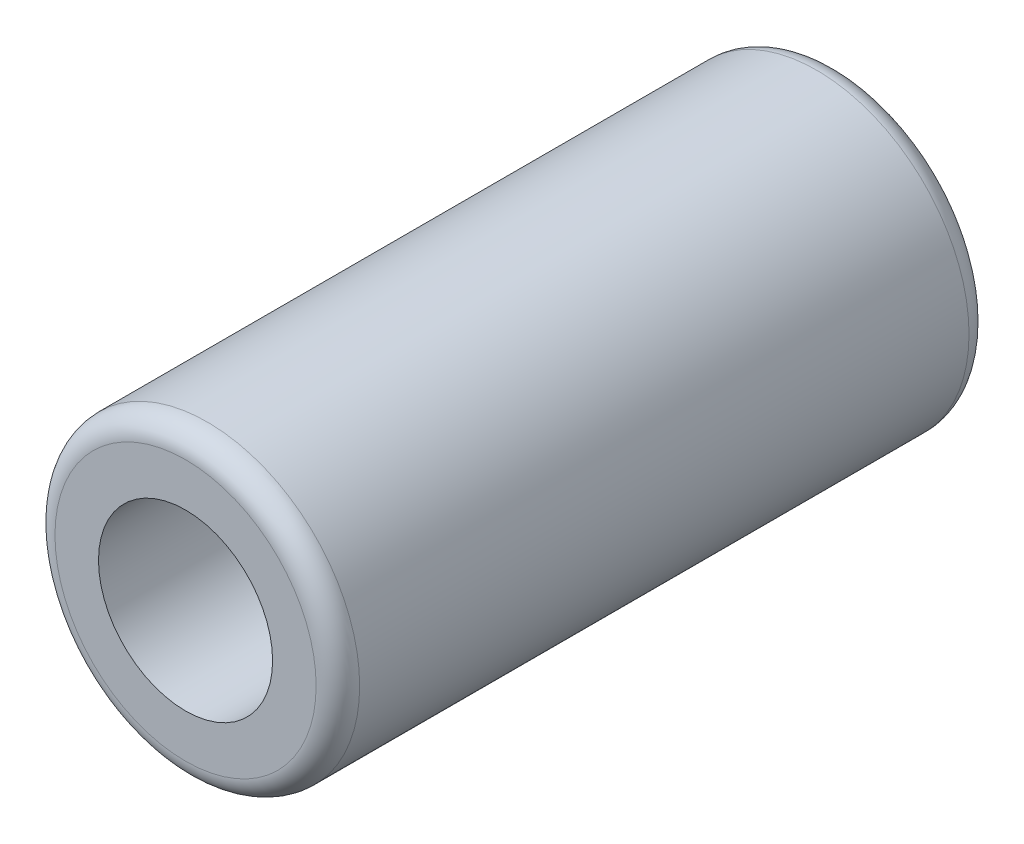
ISO-10303-21;
HEADER;
FILE_DESCRIPTION(('STEP AP214'),'2;1');
FILE_NAME('part.step','',(''),(''),'','','');
FILE_SCHEMA(('AUTOMOTIVE_DESIGN { 1 0 10303 214 1 1 1 1 }'));
ENDSEC;
DATA;
#1=APPLICATION_CONTEXT('core data for automotive mechanical design processes');
#2=APPLICATION_PROTOCOL_DEFINITION('international standard','automotive_design',2000,#1);
#3=PRODUCT_CONTEXT('',#1,'mechanical');
#4=PRODUCT('Part','Part','',(#3));
#5=PRODUCT_RELATED_PRODUCT_CATEGORY('part','',(#4));
#6=PRODUCT_DEFINITION_FORMATION('','',#4);
#7=PRODUCT_DEFINITION_CONTEXT('part definition',#1,'design');
#8=PRODUCT_DEFINITION('design','',#6,#7);
#9=PRODUCT_DEFINITION_SHAPE('','',#8);
#10=(LENGTH_UNIT() NAMED_UNIT(*) SI_UNIT(.MILLI.,.METRE.));
#11=(NAMED_UNIT(*) PLANE_ANGLE_UNIT() SI_UNIT($,.RADIAN.));
#12=(NAMED_UNIT(*) SI_UNIT($,.STERADIAN.) SOLID_ANGLE_UNIT());
#13=UNCERTAINTY_MEASURE_WITH_UNIT(LENGTH_MEASURE(1.E-05),#10,'distance_accuracy_value','');
#14=(GEOMETRIC_REPRESENTATION_CONTEXT(3) GLOBAL_UNCERTAINTY_ASSIGNED_CONTEXT((#13)) GLOBAL_UNIT_ASSIGNED_CONTEXT((#10,
#11,#12)) REPRESENTATION_CONTEXT('',''));
#15=CARTESIAN_POINT('',(0.,0.,0.));
#16=DIRECTION('',(0.,0.,1.));
#17=DIRECTION('',(1.,0.,0.));
#18=AXIS2_PLACEMENT_3D('',#15,#16,#17);
#19=CARTESIAN_POINT('',(0.,0.,30.));
#20=DIRECTION('',(0.,0.,-1.));
#21=DIRECTION('',(-1.,0.,0.));
#22=AXIS2_PLACEMENT_3D('',#19,#20,#21);
#23=CYLINDRICAL_SURFACE('',#22,2.5);
#24=CARTESIAN_POINT('',(0.,0.,0.));
#25=DIRECTION('',(0.,0.,1.));
#26=DIRECTION('',(1.,0.,0.));
#27=AXIS2_PLACEMENT_3D('',#24,#25,#26);
#28=CIRCLE('',#27,2.5);
#29=CARTESIAN_POINT('',(2.5,0.,0.));
#30=VERTEX_POINT('',#29);
#31=EDGE_CURVE('E54',#30,#30,#28,.T.);
#32=ORIENTED_EDGE('',*,*,#31,.F.);
#33=EDGE_LOOP('',(#32));
#34=FACE_BOUND('',#33,.T.);
#35=CARTESIAN_POINT('',(0.,0.,15.));
#36=DIRECTION('',(0.,0.,1.));
#37=DIRECTION('',(1.,0.,0.));
#38=AXIS2_PLACEMENT_3D('',#35,#36,#37);
#39=CIRCLE('',#38,2.5);
#40=CARTESIAN_POINT('',(2.5,0.,15.));
#41=VERTEX_POINT('',#40);
#42=EDGE_CURVE('E55',#41,#41,#39,.T.);
#43=ORIENTED_EDGE('',*,*,#42,.T.);
#44=EDGE_LOOP('',(#43));
#45=FACE_BOUND('',#44,.T.);
#46=ADVANCED_FACE('F34',(#34,#45),#23,.F.);
#47=CARTESIAN_POINT('',(0.,0.,30.));
#48=DIRECTION('',(0.,0.,1.));
#49=DIRECTION('',(1.,0.,0.));
#50=AXIS2_PLACEMENT_3D('',#47,#48,#49);
#51=PLANE('',#50);
#52=CARTESIAN_POINT('',(0.,0.,30.));
#53=DIRECTION('',(0.,0.,1.));
#54=DIRECTION('',(1.,0.,0.));
#55=AXIS2_PLACEMENT_3D('',#52,#53,#54);
#56=CIRCLE('',#55,6.);
#57=CARTESIAN_POINT('',(6.,0.,30.));
#58=VERTEX_POINT('',#57);
#59=EDGE_CURVE('E10',#58,#58,#56,.T.);
#60=ORIENTED_EDGE('',*,*,#59,.T.);
#61=EDGE_LOOP('',(#60));
#62=FACE_BOUND('',#61,.T.);
#63=CARTESIAN_POINT('',(0.,0.,30.));
#64=DIRECTION('',(0.,0.,1.));
#65=DIRECTION('',(1.,0.,0.));
#66=AXIS2_PLACEMENT_3D('',#63,#64,#65);
#67=CIRCLE('',#66,4.);
#68=CARTESIAN_POINT('',(4.,0.,30.));
#69=VERTEX_POINT('',#68);
#70=EDGE_CURVE('E61',#69,#69,#67,.T.);
#71=ORIENTED_EDGE('',*,*,#70,.F.);
#72=EDGE_LOOP('',(#71));
#73=FACE_BOUND('',#72,.T.);
#74=ADVANCED_FACE('F76',(#62,#73),#51,.T.);
#75=CARTESIAN_POINT('',(0.,0.,0.));
#76=DIRECTION('',(0.,0.,1.));
#77=DIRECTION('',(1.,0.,0.));
#78=AXIS2_PLACEMENT_3D('',#75,#76,#77);
#79=PLANE('',#78);
#80=CARTESIAN_POINT('',(0.,0.,0.));
#81=DIRECTION('',(0.,0.,1.));
#82=DIRECTION('',(1.,0.,0.));
#83=AXIS2_PLACEMENT_3D('',#80,#81,#82);
#84=CIRCLE('',#83,6.);
#85=CARTESIAN_POINT('',(6.,0.,0.));
#86=VERTEX_POINT('',#85);
#87=EDGE_CURVE('E41',#86,#86,#84,.F.);
#88=ORIENTED_EDGE('',*,*,#87,.T.);
#89=EDGE_LOOP('',(#88));
#90=FACE_BOUND('',#89,.T.);
#91=ORIENTED_EDGE('',*,*,#31,.T.);
#92=EDGE_LOOP('',(#91));
#93=FACE_BOUND('',#92,.T.);
#94=ADVANCED_FACE('F78',(#90,#93),#79,.F.);
#95=CARTESIAN_POINT('',(0.,0.,30.));
#96=DIRECTION('',(0.,0.,-1.));
#97=DIRECTION('',(-1.,0.,0.));
#98=AXIS2_PLACEMENT_3D('',#95,#96,#97);
#99=CYLINDRICAL_SURFACE('',#98,7.);
#100=CARTESIAN_POINT('',(0.,0.,1.));
#101=DIRECTION('',(0.,0.,1.));
#102=DIRECTION('',(1.,0.,0.));
#103=AXIS2_PLACEMENT_3D('',#100,#101,#102);
#104=CIRCLE('',#103,7.);
#105=CARTESIAN_POINT('',(7.,0.,1.));
#106=VERTEX_POINT('',#105);
#107=EDGE_CURVE('E45',#106,#106,#104,.T.);
#108=ORIENTED_EDGE('',*,*,#107,.T.);
#109=EDGE_LOOP('',(#108));
#110=FACE_BOUND('',#109,.T.);
#111=CARTESIAN_POINT('',(0.,0.,29.));
#112=DIRECTION('',(0.,0.,1.));
#113=DIRECTION('',(1.,0.,0.));
#114=AXIS2_PLACEMENT_3D('',#111,#112,#113);
#115=CIRCLE('',#114,7.);
#116=CARTESIAN_POINT('',(7.,0.,29.));
#117=VERTEX_POINT('',#116);
#118=EDGE_CURVE('E49',#117,#117,#115,.F.);
#119=ORIENTED_EDGE('',*,*,#118,.T.);
#120=EDGE_LOOP('',(#119));
#121=FACE_BOUND('',#120,.T.);
#122=ADVANCED_FACE('F72',(#110,#121),#99,.T.);
#123=CARTESIAN_POINT('',(0.,0.,15.));
#124=DIRECTION('',(0.,0.,1.));
#125=DIRECTION('',(1.,0.,0.));
#126=AXIS2_PLACEMENT_3D('',#123,#124,#125);
#127=CYLINDRICAL_SURFACE('',#126,4.);
#128=CARTESIAN_POINT('',(0.,0.,15.));
#129=DIRECTION('',(0.,0.,1.));
#130=DIRECTION('',(1.,0.,0.));
#131=AXIS2_PLACEMENT_3D('',#128,#129,#130);
#132=CIRCLE('',#131,4.);
#133=CARTESIAN_POINT('',(4.,0.,15.));
#134=VERTEX_POINT('',#133);
#135=EDGE_CURVE('E58',#134,#134,#132,.T.);
#136=ORIENTED_EDGE('',*,*,#135,.F.);
#137=EDGE_LOOP('',(#136));
#138=FACE_BOUND('',#137,.T.);
#139=ORIENTED_EDGE('',*,*,#70,.T.);
#140=EDGE_LOOP('',(#139));
#141=FACE_BOUND('',#140,.T.);
#142=ADVANCED_FACE('F69',(#138,#141),#127,.F.);
#143=CARTESIAN_POINT('',(0.,0.,15.));
#144=DIRECTION('',(0.,0.,1.));
#145=DIRECTION('',(1.,0.,0.));
#146=AXIS2_PLACEMENT_3D('',#143,#144,#145);
#147=PLANE('',#146);
#148=ORIENTED_EDGE('',*,*,#42,.F.);
#149=EDGE_LOOP('',(#148));
#150=FACE_BOUND('',#149,.T.);
#151=ORIENTED_EDGE('',*,*,#135,.T.);
#152=EDGE_LOOP('',(#151));
#153=FACE_BOUND('',#152,.T.);
#154=ADVANCED_FACE('F67',(#150,#153),#147,.T.);
#155=CARTESIAN_POINT('',(0.,0.,1.));
#156=DIRECTION('',(0.,0.,1.));
#157=DIRECTION('',(1.,0.,0.));
#158=AXIS2_PLACEMENT_3D('',#155,#156,#157);
#159=TOROIDAL_SURFACE('',#158,6.,1.);
#160=ORIENTED_EDGE('',*,*,#87,.F.);
#161=EDGE_LOOP('',(#160));
#162=FACE_BOUND('',#161,.T.);
#163=ORIENTED_EDGE('',*,*,#107,.F.);
#164=EDGE_LOOP('',(#163));
#165=FACE_BOUND('',#164,.T.);
#166=ADVANCED_FACE('F90',(#162,#165),#159,.T.);
#167=CARTESIAN_POINT('',(0.,0.,29.));
#168=DIRECTION('',(0.,0.,1.));
#169=DIRECTION('',(1.,0.,0.));
#170=AXIS2_PLACEMENT_3D('',#167,#168,#169);
#171=TOROIDAL_SURFACE('',#170,6.,1.);
#172=ORIENTED_EDGE('',*,*,#118,.F.);
#173=EDGE_LOOP('',(#172));
#174=FACE_BOUND('',#173,.T.);
#175=ORIENTED_EDGE('',*,*,#59,.F.);
#176=EDGE_LOOP('',(#175));
#177=FACE_BOUND('',#176,.T.);
#178=ADVANCED_FACE('F36',(#174,#177),#171,.T.);
#179=CLOSED_SHELL('',(#46,#74,#94,#122,#142,#154,#166,#178));
#180=MANIFOLD_SOLID_BREP('B2',#179);
#181=ADVANCED_BREP_SHAPE_REPRESENTATION('',(#18,#180),#14);
#182=SHAPE_DEFINITION_REPRESENTATION(#9,#181);
ENDSEC;
END-ISO-10303-21;
